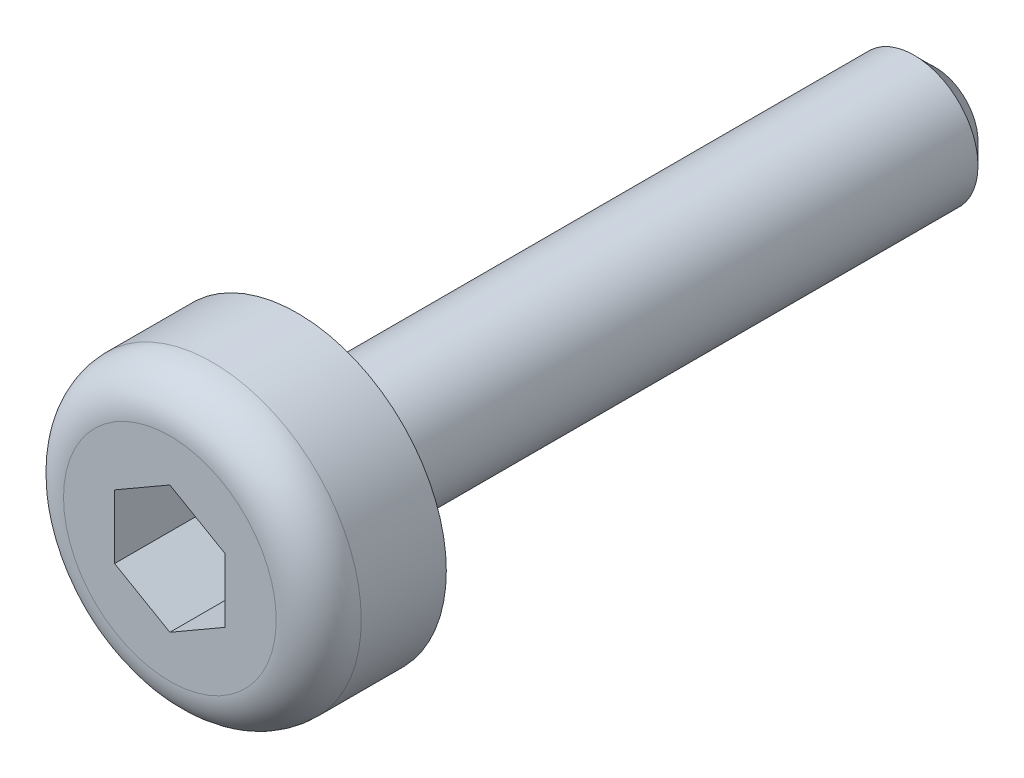
ISO-10303-21;
HEADER;
FILE_DESCRIPTION(('STEP AP214'),'2;1');
FILE_NAME('part.step','',(''),(''),'','','');
FILE_SCHEMA(('AUTOMOTIVE_DESIGN { 1 0 10303 214 1 1 1 1 }'));
ENDSEC;
DATA;
#1=APPLICATION_CONTEXT('core data for automotive mechanical design processes');
#2=APPLICATION_PROTOCOL_DEFINITION('international standard','automotive_design',2000,#1);
#3=PRODUCT_CONTEXT('',#1,'mechanical');
#4=PRODUCT('Part','Part','',(#3));
#5=PRODUCT_RELATED_PRODUCT_CATEGORY('part','',(#4));
#6=PRODUCT_DEFINITION_FORMATION('','',#4);
#7=PRODUCT_DEFINITION_CONTEXT('part definition',#1,'design');
#8=PRODUCT_DEFINITION('design','',#6,#7);
#9=PRODUCT_DEFINITION_SHAPE('','',#8);
#10=(LENGTH_UNIT() NAMED_UNIT(*) SI_UNIT(.MILLI.,.METRE.));
#11=(NAMED_UNIT(*) PLANE_ANGLE_UNIT() SI_UNIT($,.RADIAN.));
#12=(NAMED_UNIT(*) SI_UNIT($,.STERADIAN.) SOLID_ANGLE_UNIT());
#13=UNCERTAINTY_MEASURE_WITH_UNIT(LENGTH_MEASURE(1.E-05),#10,'distance_accuracy_value','');
#14=(GEOMETRIC_REPRESENTATION_CONTEXT(3) GLOBAL_UNCERTAINTY_ASSIGNED_CONTEXT((#13)) GLOBAL_UNIT_ASSIGNED_CONTEXT((#10,
#11,#12)) REPRESENTATION_CONTEXT('',''));
#15=CARTESIAN_POINT('',(0.,0.,0.));
#16=DIRECTION('',(0.,0.,1.));
#17=DIRECTION('',(1.,0.,0.));
#18=AXIS2_PLACEMENT_3D('',#15,#16,#17);
#19=CARTESIAN_POINT('',(0.,0.,0.));
#20=DIRECTION('',(0.,0.,-1.));
#21=DIRECTION('',(-1.,0.,0.));
#22=AXIS2_PLACEMENT_3D('',#19,#20,#21);
#23=PLANE('',#22);
#24=CARTESIAN_POINT('',(0.,0.,0.));
#25=DIRECTION('',(0.,0.,-1.));
#26=DIRECTION('',(-1.,0.,0.));
#27=AXIS2_PLACEMENT_3D('',#24,#25,#26);
#28=CIRCLE('',#27,2.5);
#29=CARTESIAN_POINT('',(-2.5,0.,0.));
#30=VERTEX_POINT('',#29);
#31=EDGE_CURVE('E41',#30,#30,#28,.F.);
#32=ORIENTED_EDGE('',*,*,#31,.T.);
#33=EDGE_LOOP('',(#32));
#34=FACE_BOUND('',#33,.T.);
#35=DIRECTION('',(-0.866025403784439,-0.5,0.));
#36=VECTOR('',#35,1.);
#37=CARTESIAN_POINT('',(0.,1.5,0.));
#38=LINE('',#37,#36);
#39=CARTESIAN_POINT('',(0.,1.5,0.));
#40=VERTEX_POINT('',#39);
#41=CARTESIAN_POINT('',(-1.29903810567666,0.75,0.));
#42=VERTEX_POINT('',#41);
#43=EDGE_CURVE('E122',#40,#42,#38,.T.);
#44=ORIENTED_EDGE('',*,*,#43,.F.);
#45=DIRECTION('',(-0.866025403784439,0.5,0.));
#46=VECTOR('',#45,1.);
#47=CARTESIAN_POINT('',(1.29903810567666,0.750000000000001,0.));
#48=LINE('',#47,#46);
#49=CARTESIAN_POINT('',(1.29903810567666,0.750000000000001,0.));
#50=VERTEX_POINT('',#49);
#51=EDGE_CURVE('E48',#50,#40,#48,.T.);
#52=ORIENTED_EDGE('',*,*,#51,.F.);
#53=DIRECTION('',(0.,1.,0.));
#54=VECTOR('',#53,1.);
#55=CARTESIAN_POINT('',(1.29903810567666,-0.750000000000001,0.));
#56=LINE('',#55,#54);
#57=CARTESIAN_POINT('',(1.29903810567666,-0.750000000000001,0.));
#58=VERTEX_POINT('',#57);
#59=EDGE_CURVE('E131',#58,#50,#56,.T.);
#60=ORIENTED_EDGE('',*,*,#59,.F.);
#61=DIRECTION('',(0.866025403784439,0.5,0.));
#62=VECTOR('',#61,1.);
#63=CARTESIAN_POINT('',(0.,-1.5,0.));
#64=LINE('',#63,#62);
#65=CARTESIAN_POINT('',(0.,-1.5,0.));
#66=VERTEX_POINT('',#65);
#67=EDGE_CURVE('E129',#66,#58,#64,.T.);
#68=ORIENTED_EDGE('',*,*,#67,.F.);
#69=DIRECTION('',(0.866025403784438,-0.5,0.));
#70=VECTOR('',#69,1.);
#71=CARTESIAN_POINT('',(-1.29903810567666,-0.75,0.));
#72=LINE('',#71,#70);
#73=CARTESIAN_POINT('',(-1.29903810567666,-0.75,0.));
#74=VERTEX_POINT('',#73);
#75=EDGE_CURVE('E96',#74,#66,#72,.T.);
#76=ORIENTED_EDGE('',*,*,#75,.F.);
#77=DIRECTION('',(0.,-1.,0.));
#78=VECTOR('',#77,1.);
#79=CARTESIAN_POINT('',(-1.29903810567666,0.75,0.));
#80=LINE('',#79,#78);
#81=EDGE_CURVE('E125',#42,#74,#80,.T.);
#82=ORIENTED_EDGE('',*,*,#81,.F.);
#83=EDGE_LOOP('',(#44,#52,#60,#68,#76,#82));
#84=FACE_BOUND('',#83,.T.);
#85=ADVANCED_FACE('F33',(#34,#84),#23,.F.);
#86=CARTESIAN_POINT('',(0.,0.,156.291575098795));
#87=DIRECTION('',(0.,0.,1.));
#88=DIRECTION('',(1.,0.,0.));
#89=AXIS2_PLACEMENT_3D('',#86,#87,#88);
#90=CYLINDRICAL_SURFACE('',#89,3.5);
#91=CARTESIAN_POINT('',(0.,0.,-1.));
#92=DIRECTION('',(0.,0.,-1.));
#93=DIRECTION('',(-1.,0.,0.));
#94=AXIS2_PLACEMENT_3D('',#91,#92,#93);
#95=CIRCLE('',#94,3.5);
#96=CARTESIAN_POINT('',(-3.5,0.,-1.));
#97=VERTEX_POINT('',#96);
#98=EDGE_CURVE('E11',#97,#97,#95,.T.);
#99=ORIENTED_EDGE('',*,*,#98,.T.);
#100=EDGE_LOOP('',(#99));
#101=FACE_BOUND('',#100,.T.);
#102=CARTESIAN_POINT('',(0.,0.,-3.));
#103=DIRECTION('',(0.,0.,1.));
#104=DIRECTION('',(1.,0.,0.));
#105=AXIS2_PLACEMENT_3D('',#102,#103,#104);
#106=CIRCLE('',#105,3.5);
#107=CARTESIAN_POINT('',(3.5,0.,-3.));
#108=VERTEX_POINT('',#107);
#109=EDGE_CURVE('E143',#108,#108,#106,.T.);
#110=ORIENTED_EDGE('',*,*,#109,.T.);
#111=EDGE_LOOP('',(#110));
#112=FACE_BOUND('',#111,.T.);
#113=ADVANCED_FACE('F165',(#101,#112),#90,.T.);
#114=CARTESIAN_POINT('',(0.,3.5,-3.));
#115=DIRECTION('',(0.,0.,1.));
#116=DIRECTION('',(1.,0.,0.));
#117=AXIS2_PLACEMENT_3D('',#114,#115,#116);
#118=PLANE('',#117);
#119=ORIENTED_EDGE('',*,*,#109,.F.);
#120=EDGE_LOOP('',(#119));
#121=FACE_BOUND('',#120,.T.);
#122=CARTESIAN_POINT('',(0.,0.,-3.));
#123=DIRECTION('',(0.,0.,1.));
#124=DIRECTION('',(1.,0.,0.));
#125=AXIS2_PLACEMENT_3D('',#122,#123,#124);
#126=CIRCLE('',#125,1.5);
#127=CARTESIAN_POINT('',(1.5,0.,-3.));
#128=VERTEX_POINT('',#127);
#129=EDGE_CURVE('E135',#128,#128,#126,.T.);
#130=ORIENTED_EDGE('',*,*,#129,.T.);
#131=EDGE_LOOP('',(#130));
#132=FACE_BOUND('',#131,.T.);
#133=ADVANCED_FACE('F170',(#121,#132),#118,.F.);
#134=CARTESIAN_POINT('',(0.,0.,156.291575098795));
#135=DIRECTION('',(0.,0.,1.));
#136=DIRECTION('',(1.,0.,0.));
#137=AXIS2_PLACEMENT_3D('',#134,#135,#136);
#138=CYLINDRICAL_SURFACE('',#137,1.5);
#139=CARTESIAN_POINT('',(0.,0.,-17.5));
#140=DIRECTION('',(0.,0.,1.));
#141=DIRECTION('',(1.,0.,0.));
#142=AXIS2_PLACEMENT_3D('',#139,#140,#141);
#143=CIRCLE('',#142,1.5);
#144=CARTESIAN_POINT('',(1.5,0.,-17.5));
#145=VERTEX_POINT('',#144);
#146=EDGE_CURVE('E146',#145,#145,#143,.T.);
#147=ORIENTED_EDGE('',*,*,#146,.T.);
#148=EDGE_LOOP('',(#147));
#149=FACE_BOUND('',#148,.T.);
#150=ORIENTED_EDGE('',*,*,#129,.F.);
#151=EDGE_LOOP('',(#150));
#152=FACE_BOUND('',#151,.T.);
#153=ADVANCED_FACE('F176',(#149,#152),#138,.T.);
#154=CARTESIAN_POINT('',(0.,1.5,-18.));
#155=DIRECTION('',(0.,0.,1.));
#156=DIRECTION('',(1.,0.,0.));
#157=AXIS2_PLACEMENT_3D('',#154,#155,#156);
#158=PLANE('',#157);
#159=CARTESIAN_POINT('',(0.,0.,-18.));
#160=DIRECTION('',(0.,0.,1.));
#161=DIRECTION('',(1.,0.,0.));
#162=AXIS2_PLACEMENT_3D('',#159,#160,#161);
#163=CIRCLE('',#162,0.999999999999977);
#164=CARTESIAN_POINT('',(0.999999999999977,0.,-18.));
#165=VERTEX_POINT('',#164);
#166=EDGE_CURVE('E149',#165,#165,#163,.F.);
#167=ORIENTED_EDGE('',*,*,#166,.T.);
#168=EDGE_LOOP('',(#167));
#169=FACE_BOUND('',#168,.T.);
#170=ADVANCED_FACE('F180',(#169),#158,.F.);
#171=CARTESIAN_POINT('',(1.29903810567666,0.750000000000001,-2.5));
#172=DIRECTION('',(0.5,0.866025403784439,0.));
#173=DIRECTION('',(-0.866025403784439,0.5,0.));
#174=AXIS2_PLACEMENT_3D('',#171,#172,#173);
#175=PLANE('',#174);
#176=ORIENTED_EDGE('',*,*,#51,.T.);
#177=DIRECTION('',(0.,0.,1.));
#178=VECTOR('',#177,1.);
#179=CARTESIAN_POINT('',(0.,1.5,-2.5));
#180=LINE('',#179,#178);
#181=CARTESIAN_POINT('',(0.,1.5,-2.5));
#182=VERTEX_POINT('',#181);
#183=EDGE_CURVE('E78',#182,#40,#180,.T.);
#184=ORIENTED_EDGE('',*,*,#183,.F.);
#185=DIRECTION('',(-0.866025403784439,0.5,0.));
#186=VECTOR('',#185,1.);
#187=CARTESIAN_POINT('',(1.29903810567666,0.750000000000001,-2.5));
#188=LINE('',#187,#186);
#189=CARTESIAN_POINT('',(1.29903810567666,0.750000000000001,-2.5));
#190=VERTEX_POINT('',#189);
#191=EDGE_CURVE('E133',#190,#182,#188,.T.);
#192=ORIENTED_EDGE('',*,*,#191,.F.);
#193=DIRECTION('',(0.,0.,1.));
#194=VECTOR('',#193,1.);
#195=CARTESIAN_POINT('',(1.29903810567666,0.750000000000001,-2.5));
#196=LINE('',#195,#194);
#197=EDGE_CURVE('E56',#190,#50,#196,.T.);
#198=ORIENTED_EDGE('',*,*,#197,.T.);
#199=EDGE_LOOP('',(#176,#184,#192,#198));
#200=FACE_BOUND('',#199,.T.);
#201=ADVANCED_FACE('F184',(#200),#175,.F.);
#202=CARTESIAN_POINT('',(1.29903810567666,-0.750000000000001,-2.5));
#203=DIRECTION('',(1.,0.,0.));
#204=DIRECTION('',(0.,1.,0.));
#205=AXIS2_PLACEMENT_3D('',#202,#203,#204);
#206=PLANE('',#205);
#207=ORIENTED_EDGE('',*,*,#59,.T.);
#208=ORIENTED_EDGE('',*,*,#197,.F.);
#209=DIRECTION('',(0.,1.,0.));
#210=VECTOR('',#209,1.);
#211=CARTESIAN_POINT('',(1.29903810567666,-0.750000000000001,-2.5));
#212=LINE('',#211,#210);
#213=CARTESIAN_POINT('',(1.29903810567666,-0.750000000000001,-2.5));
#214=VERTEX_POINT('',#213);
#215=EDGE_CURVE('E108',#214,#190,#212,.T.);
#216=ORIENTED_EDGE('',*,*,#215,.F.);
#217=DIRECTION('',(0.,0.,1.));
#218=VECTOR('',#217,1.);
#219=CARTESIAN_POINT('',(1.29903810567666,-0.750000000000001,-2.5));
#220=LINE('',#219,#218);
#221=EDGE_CURVE('E100',#214,#58,#220,.T.);
#222=ORIENTED_EDGE('',*,*,#221,.T.);
#223=EDGE_LOOP('',(#207,#208,#216,#222));
#224=FACE_BOUND('',#223,.T.);
#225=ADVANCED_FACE('F188',(#224),#206,.F.);
#226=CARTESIAN_POINT('',(0.,-1.5,-2.5));
#227=DIRECTION('',(0.5,-0.866025403784439,0.));
#228=DIRECTION('',(0.866025403784439,0.5,0.));
#229=AXIS2_PLACEMENT_3D('',#226,#227,#228);
#230=PLANE('',#229);
#231=ORIENTED_EDGE('',*,*,#67,.T.);
#232=ORIENTED_EDGE('',*,*,#221,.F.);
#233=DIRECTION('',(0.866025403784439,0.5,0.));
#234=VECTOR('',#233,1.);
#235=CARTESIAN_POINT('',(0.,-1.5,-2.5));
#236=LINE('',#235,#234);
#237=CARTESIAN_POINT('',(0.,-1.5,-2.5));
#238=VERTEX_POINT('',#237);
#239=EDGE_CURVE('E104',#238,#214,#236,.T.);
#240=ORIENTED_EDGE('',*,*,#239,.F.);
#241=DIRECTION('',(0.,0.,1.));
#242=VECTOR('',#241,1.);
#243=CARTESIAN_POINT('',(0.,-1.5,-2.5));
#244=LINE('',#243,#242);
#245=EDGE_CURVE('E89',#238,#66,#244,.T.);
#246=ORIENTED_EDGE('',*,*,#245,.T.);
#247=EDGE_LOOP('',(#231,#232,#240,#246));
#248=FACE_BOUND('',#247,.T.);
#249=ADVANCED_FACE('F105',(#248),#230,.F.);
#250=CARTESIAN_POINT('',(-1.29903810567666,-0.75,-2.5));
#251=DIRECTION('',(-0.5,-0.866025403784438,0.));
#252=DIRECTION('',(0.866025403784439,-0.5,0.));
#253=AXIS2_PLACEMENT_3D('',#250,#251,#252);
#254=PLANE('',#253);
#255=ORIENTED_EDGE('',*,*,#75,.T.);
#256=ORIENTED_EDGE('',*,*,#245,.F.);
#257=DIRECTION('',(0.866025403784438,-0.5,0.));
#258=VECTOR('',#257,1.);
#259=CARTESIAN_POINT('',(-1.29903810567666,-0.75,-2.5));
#260=LINE('',#259,#258);
#261=CARTESIAN_POINT('',(-1.29903810567666,-0.75,-2.5));
#262=VERTEX_POINT('',#261);
#263=EDGE_CURVE('E93',#262,#238,#260,.T.);
#264=ORIENTED_EDGE('',*,*,#263,.F.);
#265=DIRECTION('',(0.,0.,1.));
#266=VECTOR('',#265,1.);
#267=CARTESIAN_POINT('',(-1.29903810567666,-0.75,-2.5));
#268=LINE('',#267,#266);
#269=EDGE_CURVE('E101',#262,#74,#268,.T.);
#270=ORIENTED_EDGE('',*,*,#269,.T.);
#271=EDGE_LOOP('',(#255,#256,#264,#270));
#272=FACE_BOUND('',#271,.T.);
#273=ADVANCED_FACE('F91',(#272),#254,.F.);
#274=CARTESIAN_POINT('',(-1.29903810567666,0.75,-2.5));
#275=DIRECTION('',(-1.,0.,0.));
#276=DIRECTION('',(0.,-1.,0.));
#277=AXIS2_PLACEMENT_3D('',#274,#275,#276);
#278=PLANE('',#277);
#279=ORIENTED_EDGE('',*,*,#81,.T.);
#280=ORIENTED_EDGE('',*,*,#269,.F.);
#281=DIRECTION('',(0.,-1.,0.));
#282=VECTOR('',#281,1.);
#283=CARTESIAN_POINT('',(-1.29903810567666,0.75,-2.5));
#284=LINE('',#283,#282);
#285=CARTESIAN_POINT('',(-1.29903810567666,0.75,-2.5));
#286=VERTEX_POINT('',#285);
#287=EDGE_CURVE('E114',#286,#262,#284,.T.);
#288=ORIENTED_EDGE('',*,*,#287,.F.);
#289=DIRECTION('',(0.,0.,1.));
#290=VECTOR('',#289,1.);
#291=CARTESIAN_POINT('',(-1.29903810567666,0.75,-2.5));
#292=LINE('',#291,#290);
#293=EDGE_CURVE('E138',#286,#42,#292,.T.);
#294=ORIENTED_EDGE('',*,*,#293,.T.);
#295=EDGE_LOOP('',(#279,#280,#288,#294));
#296=FACE_BOUND('',#295,.T.);
#297=ADVANCED_FACE('F192',(#296),#278,.F.);
#298=CARTESIAN_POINT('',(0.,1.5,-2.5));
#299=DIRECTION('',(-0.5,0.866025403784439,0.));
#300=DIRECTION('',(-0.866025403784439,-0.5,0.));
#301=AXIS2_PLACEMENT_3D('',#298,#299,#300);
#302=PLANE('',#301);
#303=ORIENTED_EDGE('',*,*,#43,.T.);
#304=ORIENTED_EDGE('',*,*,#293,.F.);
#305=DIRECTION('',(-0.866025403784439,-0.5,0.));
#306=VECTOR('',#305,1.);
#307=CARTESIAN_POINT('',(0.,1.5,-2.5));
#308=LINE('',#307,#306);
#309=EDGE_CURVE('E116',#182,#286,#308,.T.);
#310=ORIENTED_EDGE('',*,*,#309,.F.);
#311=ORIENTED_EDGE('',*,*,#183,.T.);
#312=EDGE_LOOP('',(#303,#304,#310,#311));
#313=FACE_BOUND('',#312,.T.);
#314=ADVANCED_FACE('F189',(#313),#302,.F.);
#315=CARTESIAN_POINT('',(0.,0.,-2.5));
#316=DIRECTION('',(0.,0.,1.));
#317=DIRECTION('',(1.,0.,0.));
#318=AXIS2_PLACEMENT_3D('',#315,#316,#317);
#319=PLANE('',#318);
#320=ORIENTED_EDGE('',*,*,#191,.T.);
#321=ORIENTED_EDGE('',*,*,#309,.T.);
#322=ORIENTED_EDGE('',*,*,#287,.T.);
#323=ORIENTED_EDGE('',*,*,#263,.T.);
#324=ORIENTED_EDGE('',*,*,#239,.T.);
#325=ORIENTED_EDGE('',*,*,#215,.T.);
#326=EDGE_LOOP('',(#320,#321,#322,#323,#324,#325));
#327=FACE_BOUND('',#326,.T.);
#328=ADVANCED_FACE('F111',(#327),#319,.T.);
#329=CARTESIAN_POINT('',(0.,0.,-17.5));
#330=DIRECTION('',(0.,0.,1.));
#331=DIRECTION('',(1.,0.,0.));
#332=AXIS2_PLACEMENT_3D('',#329,#330,#331);
#333=CONICAL_SURFACE('',#332,1.5,0.785398163397457);
#334=ORIENTED_EDGE('',*,*,#166,.F.);
#335=EDGE_LOOP('',(#334));
#336=FACE_BOUND('',#335,.T.);
#337=ORIENTED_EDGE('',*,*,#146,.F.);
#338=EDGE_LOOP('',(#337));
#339=FACE_BOUND('',#338,.T.);
#340=ADVANCED_FACE('F157',(#336,#339),#333,.T.);
#341=CARTESIAN_POINT('',(0.,0.,-1.));
#342=DIRECTION('',(0.,0.,-1.));
#343=DIRECTION('',(-1.,0.,0.));
#344=AXIS2_PLACEMENT_3D('',#341,#342,#343);
#345=TOROIDAL_SURFACE('',#344,2.5,1.);
#346=ORIENTED_EDGE('',*,*,#98,.F.);
#347=EDGE_LOOP('',(#346));
#348=FACE_BOUND('',#347,.T.);
#349=ORIENTED_EDGE('',*,*,#31,.F.);
#350=EDGE_LOOP('',(#349));
#351=FACE_BOUND('',#350,.T.);
#352=ADVANCED_FACE('F35',(#348,#351),#345,.T.);
#353=CLOSED_SHELL('',(#85,#113,#133,#153,#170,#201,#225,#249,#273,#297,#314,#328,#340,#352));
#354=MANIFOLD_SOLID_BREP('B2',#353);
#355=ADVANCED_BREP_SHAPE_REPRESENTATION('',(#18,#354),#14);
#356=SHAPE_DEFINITION_REPRESENTATION(#9,#355);
ENDSEC;
END-ISO-10303-21;
